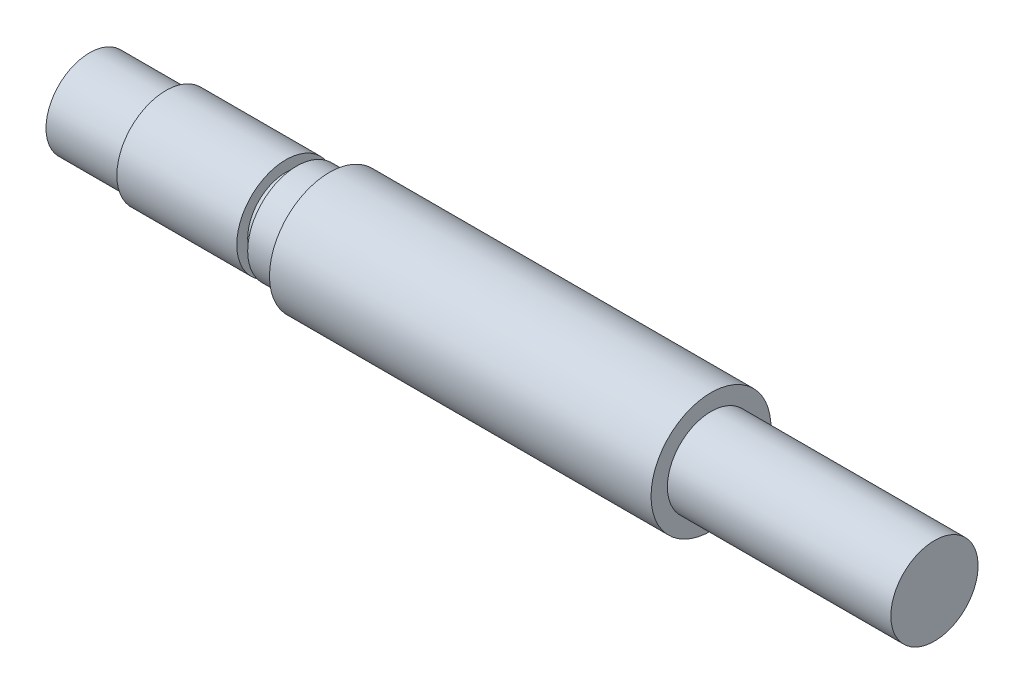
ISO-10303-21;
HEADER;
FILE_DESCRIPTION(('STEP AP214'),'2;1');
FILE_NAME('part.step','',(''),(''),'','','');
FILE_SCHEMA(('AUTOMOTIVE_DESIGN { 1 0 10303 214 1 1 1 1 }'));
ENDSEC;
DATA;
#1=APPLICATION_CONTEXT('core data for automotive mechanical design processes');
#2=APPLICATION_PROTOCOL_DEFINITION('international standard','automotive_design',2000,#1);
#3=PRODUCT_CONTEXT('',#1,'mechanical');
#4=PRODUCT('Part','Part','',(#3));
#5=PRODUCT_RELATED_PRODUCT_CATEGORY('part','',(#4));
#6=PRODUCT_DEFINITION_FORMATION('','',#4);
#7=PRODUCT_DEFINITION_CONTEXT('part definition',#1,'design');
#8=PRODUCT_DEFINITION('design','',#6,#7);
#9=PRODUCT_DEFINITION_SHAPE('','',#8);
#10=(LENGTH_UNIT() NAMED_UNIT(*) SI_UNIT(.MILLI.,.METRE.));
#11=(NAMED_UNIT(*) PLANE_ANGLE_UNIT() SI_UNIT($,.RADIAN.));
#12=(NAMED_UNIT(*) SI_UNIT($,.STERADIAN.) SOLID_ANGLE_UNIT());
#13=UNCERTAINTY_MEASURE_WITH_UNIT(LENGTH_MEASURE(1.E-05),#10,'distance_accuracy_value','');
#14=(GEOMETRIC_REPRESENTATION_CONTEXT(3) GLOBAL_UNCERTAINTY_ASSIGNED_CONTEXT((#13)) GLOBAL_UNIT_ASSIGNED_CONTEXT((#10,
#11,#12)) REPRESENTATION_CONTEXT('',''));
#15=CARTESIAN_POINT('',(0.,0.,0.));
#16=DIRECTION('',(0.,0.,1.));
#17=DIRECTION('',(1.,0.,0.));
#18=AXIS2_PLACEMENT_3D('',#15,#16,#17);
#19=CARTESIAN_POINT('',(0.,0.,0.));
#20=DIRECTION('',(1.,0.,0.));
#21=DIRECTION('',(0.,0.,-1.));
#22=AXIS2_PLACEMENT_3D('',#19,#20,#21);
#23=PLANE('',#22);
#24=CARTESIAN_POINT('',(0.,0.,0.));
#25=DIRECTION('',(-1.,0.,0.));
#26=DIRECTION('',(0.,0.,1.));
#27=AXIS2_PLACEMENT_3D('',#24,#25,#26);
#28=CIRCLE('',#27,3.99999999999999);
#29=CARTESIAN_POINT('',(0.,0.,3.99999999999999));
#30=VERTEX_POINT('',#29);
#31=EDGE_CURVE('E10',#30,#30,#28,.T.);
#32=ORIENTED_EDGE('',*,*,#31,.T.);
#33=EDGE_LOOP('',(#32));
#34=FACE_BOUND('',#33,.T.);
#35=ADVANCED_FACE('F33',(#34),#23,.F.);
#36=CARTESIAN_POINT('',(0.,0.,0.));
#37=DIRECTION('',(-1.,0.,0.));
#38=DIRECTION('',(0.,0.,1.));
#39=AXIS2_PLACEMENT_3D('',#36,#37,#38);
#40=CYLINDRICAL_SURFACE('',#39,3.99999999999999);
#41=ORIENTED_EDGE('',*,*,#31,.F.);
#42=EDGE_LOOP('',(#41));
#43=FACE_BOUND('',#42,.T.);
#44=CARTESIAN_POINT('',(7.,0.,0.));
#45=DIRECTION('',(-1.,0.,0.));
#46=DIRECTION('',(0.,0.,1.));
#47=AXIS2_PLACEMENT_3D('',#44,#45,#46);
#48=CIRCLE('',#47,3.99999999999999);
#49=CARTESIAN_POINT('',(7.,0.,3.99999999999999));
#50=VERTEX_POINT('',#49);
#51=EDGE_CURVE('E39',#50,#50,#48,.T.);
#52=ORIENTED_EDGE('',*,*,#51,.T.);
#53=EDGE_LOOP('',(#52));
#54=FACE_BOUND('',#53,.T.);
#55=ADVANCED_FACE('F89',(#43,#54),#40,.T.);
#56=CARTESIAN_POINT('',(7.,3.99999999999999,0.));
#57=DIRECTION('',(1.,0.,0.));
#58=DIRECTION('',(0.,0.,-1.));
#59=AXIS2_PLACEMENT_3D('',#56,#57,#58);
#60=PLANE('',#59);
#61=ORIENTED_EDGE('',*,*,#51,.F.);
#62=EDGE_LOOP('',(#61));
#63=FACE_BOUND('',#62,.T.);
#64=CARTESIAN_POINT('',(7.,0.,0.));
#65=DIRECTION('',(-1.,0.,0.));
#66=DIRECTION('',(0.,0.,1.));
#67=AXIS2_PLACEMENT_3D('',#64,#65,#66);
#68=CIRCLE('',#67,4.5);
#69=CARTESIAN_POINT('',(7.,0.,4.5));
#70=VERTEX_POINT('',#69);
#71=EDGE_CURVE('E43',#70,#70,#68,.T.);
#72=ORIENTED_EDGE('',*,*,#71,.T.);
#73=EDGE_LOOP('',(#72));
#74=FACE_BOUND('',#73,.T.);
#75=ADVANCED_FACE('F93',(#63,#74),#60,.F.);
#76=CARTESIAN_POINT('',(0.,0.,0.));
#77=DIRECTION('',(-1.,0.,0.));
#78=DIRECTION('',(0.,0.,1.));
#79=AXIS2_PLACEMENT_3D('',#76,#77,#78);
#80=CYLINDRICAL_SURFACE('',#79,4.5);
#81=ORIENTED_EDGE('',*,*,#71,.F.);
#82=EDGE_LOOP('',(#81));
#83=FACE_BOUND('',#82,.T.);
#84=CARTESIAN_POINT('',(18.,0.,0.));
#85=DIRECTION('',(-1.,0.,0.));
#86=DIRECTION('',(0.,0.,1.));
#87=AXIS2_PLACEMENT_3D('',#84,#85,#86);
#88=CIRCLE('',#87,4.5);
#89=CARTESIAN_POINT('',(18.,0.,4.5));
#90=VERTEX_POINT('',#89);
#91=EDGE_CURVE('E47',#90,#90,#88,.T.);
#92=ORIENTED_EDGE('',*,*,#91,.T.);
#93=EDGE_LOOP('',(#92));
#94=FACE_BOUND('',#93,.T.);
#95=ADVANCED_FACE('F98',(#83,#94),#80,.T.);
#96=CARTESIAN_POINT('',(18.,4.5,0.));
#97=DIRECTION('',(-1.,0.,0.));
#98=DIRECTION('',(0.,0.,1.));
#99=AXIS2_PLACEMENT_3D('',#96,#97,#98);
#100=PLANE('',#99);
#101=ORIENTED_EDGE('',*,*,#91,.F.);
#102=EDGE_LOOP('',(#101));
#103=FACE_BOUND('',#102,.T.);
#104=CARTESIAN_POINT('',(18.,0.,0.));
#105=DIRECTION('',(-1.,0.,0.));
#106=DIRECTION('',(0.,0.,1.));
#107=AXIS2_PLACEMENT_3D('',#104,#105,#106);
#108=CIRCLE('',#107,3.5);
#109=CARTESIAN_POINT('',(18.,0.,3.5));
#110=VERTEX_POINT('',#109);
#111=EDGE_CURVE('E52',#110,#110,#108,.T.);
#112=ORIENTED_EDGE('',*,*,#111,.T.);
#113=EDGE_LOOP('',(#112));
#114=FACE_BOUND('',#113,.T.);
#115=ADVANCED_FACE('F104',(#103,#114),#100,.F.);
#116=CARTESIAN_POINT('',(0.,0.,0.));
#117=DIRECTION('',(-1.,0.,0.));
#118=DIRECTION('',(0.,0.,1.));
#119=AXIS2_PLACEMENT_3D('',#116,#117,#118);
#120=CYLINDRICAL_SURFACE('',#119,3.5);
#121=ORIENTED_EDGE('',*,*,#111,.F.);
#122=EDGE_LOOP('',(#121));
#123=FACE_BOUND('',#122,.T.);
#124=CARTESIAN_POINT('',(19.,0.,0.));
#125=DIRECTION('',(-1.,0.,0.));
#126=DIRECTION('',(0.,0.,1.));
#127=AXIS2_PLACEMENT_3D('',#124,#125,#126);
#128=CIRCLE('',#127,3.5);
#129=CARTESIAN_POINT('',(19.,0.,3.5));
#130=VERTEX_POINT('',#129);
#131=EDGE_CURVE('E55',#130,#130,#128,.T.);
#132=ORIENTED_EDGE('',*,*,#131,.T.);
#133=EDGE_LOOP('',(#132));
#134=FACE_BOUND('',#133,.T.);
#135=ADVANCED_FACE('F108',(#123,#134),#120,.T.);
#136=CARTESIAN_POINT('',(19.,3.5,0.));
#137=DIRECTION('',(1.,0.,0.));
#138=DIRECTION('',(0.,0.,-1.));
#139=AXIS2_PLACEMENT_3D('',#136,#137,#138);
#140=PLANE('',#139);
#141=ORIENTED_EDGE('',*,*,#131,.F.);
#142=EDGE_LOOP('',(#141));
#143=FACE_BOUND('',#142,.T.);
#144=CARTESIAN_POINT('',(19.,0.,0.));
#145=DIRECTION('',(-1.,0.,0.));
#146=DIRECTION('',(0.,0.,1.));
#147=AXIS2_PLACEMENT_3D('',#144,#145,#146);
#148=CIRCLE('',#147,4.5);
#149=CARTESIAN_POINT('',(19.,0.,4.5));
#150=VERTEX_POINT('',#149);
#151=EDGE_CURVE('E58',#150,#150,#148,.T.);
#152=ORIENTED_EDGE('',*,*,#151,.T.);
#153=EDGE_LOOP('',(#152));
#154=FACE_BOUND('',#153,.T.);
#155=ADVANCED_FACE('F112',(#143,#154),#140,.F.);
#156=CARTESIAN_POINT('',(0.,0.,0.));
#157=DIRECTION('',(-1.,0.,0.));
#158=DIRECTION('',(0.,0.,1.));
#159=AXIS2_PLACEMENT_3D('',#156,#157,#158);
#160=CYLINDRICAL_SURFACE('',#159,4.5);
#161=ORIENTED_EDGE('',*,*,#151,.F.);
#162=EDGE_LOOP('',(#161));
#163=FACE_BOUND('',#162,.T.);
#164=CARTESIAN_POINT('',(22.,0.,0.));
#165=DIRECTION('',(-1.,0.,0.));
#166=DIRECTION('',(0.,0.,1.));
#167=AXIS2_PLACEMENT_3D('',#164,#165,#166);
#168=CIRCLE('',#167,4.5);
#169=CARTESIAN_POINT('',(22.,0.,4.5));
#170=VERTEX_POINT('',#169);
#171=EDGE_CURVE('E61',#170,#170,#168,.T.);
#172=ORIENTED_EDGE('',*,*,#171,.T.);
#173=EDGE_LOOP('',(#172));
#174=FACE_BOUND('',#173,.T.);
#175=ADVANCED_FACE('F116',(#163,#174),#160,.T.);
#176=CARTESIAN_POINT('',(22.,4.5,0.));
#177=DIRECTION('',(1.,0.,0.));
#178=DIRECTION('',(0.,0.,-1.));
#179=AXIS2_PLACEMENT_3D('',#176,#177,#178);
#180=PLANE('',#179);
#181=ORIENTED_EDGE('',*,*,#171,.F.);
#182=EDGE_LOOP('',(#181));
#183=FACE_BOUND('',#182,.T.);
#184=CARTESIAN_POINT('',(22.,0.,0.));
#185=DIRECTION('',(-1.,0.,0.));
#186=DIRECTION('',(0.,0.,1.));
#187=AXIS2_PLACEMENT_3D('',#184,#185,#186);
#188=CIRCLE('',#187,5.49999999999999);
#189=CARTESIAN_POINT('',(22.,0.,5.49999999999999));
#190=VERTEX_POINT('',#189);
#191=EDGE_CURVE('E64',#190,#190,#188,.T.);
#192=ORIENTED_EDGE('',*,*,#191,.T.);
#193=EDGE_LOOP('',(#192));
#194=FACE_BOUND('',#193,.T.);
#195=ADVANCED_FACE('F120',(#183,#194),#180,.F.);
#196=CARTESIAN_POINT('',(0.,0.,0.));
#197=DIRECTION('',(-1.,0.,0.));
#198=DIRECTION('',(0.,0.,1.));
#199=AXIS2_PLACEMENT_3D('',#196,#197,#198);
#200=CYLINDRICAL_SURFACE('',#199,5.49999999999999);
#201=ORIENTED_EDGE('',*,*,#191,.F.);
#202=EDGE_LOOP('',(#201));
#203=FACE_BOUND('',#202,.T.);
#204=CARTESIAN_POINT('',(57.,0.,0.));
#205=DIRECTION('',(-1.,0.,0.));
#206=DIRECTION('',(0.,0.,1.));
#207=AXIS2_PLACEMENT_3D('',#204,#205,#206);
#208=CIRCLE('',#207,5.49999999999999);
#209=CARTESIAN_POINT('',(57.,0.,5.49999999999999));
#210=VERTEX_POINT('',#209);
#211=EDGE_CURVE('E67',#210,#210,#208,.T.);
#212=ORIENTED_EDGE('',*,*,#211,.T.);
#213=EDGE_LOOP('',(#212));
#214=FACE_BOUND('',#213,.T.);
#215=ADVANCED_FACE('F124',(#203,#214),#200,.T.);
#216=CARTESIAN_POINT('',(57.,5.49999999999999,0.));
#217=DIRECTION('',(-1.,0.,0.));
#218=DIRECTION('',(0.,0.,1.));
#219=AXIS2_PLACEMENT_3D('',#216,#217,#218);
#220=PLANE('',#219);
#221=ORIENTED_EDGE('',*,*,#211,.F.);
#222=EDGE_LOOP('',(#221));
#223=FACE_BOUND('',#222,.T.);
#224=CARTESIAN_POINT('',(57.,0.,0.));
#225=DIRECTION('',(-1.,0.,0.));
#226=DIRECTION('',(0.,0.,1.));
#227=AXIS2_PLACEMENT_3D('',#224,#225,#226);
#228=CIRCLE('',#227,3.99999999999999);
#229=CARTESIAN_POINT('',(57.,0.,3.99999999999999));
#230=VERTEX_POINT('',#229);
#231=EDGE_CURVE('E70',#230,#230,#228,.T.);
#232=ORIENTED_EDGE('',*,*,#231,.T.);
#233=EDGE_LOOP('',(#232));
#234=FACE_BOUND('',#233,.T.);
#235=ADVANCED_FACE('F85',(#223,#234),#220,.F.);
#236=CARTESIAN_POINT('',(0.,0.,0.));
#237=DIRECTION('',(-1.,0.,0.));
#238=DIRECTION('',(0.,0.,1.));
#239=AXIS2_PLACEMENT_3D('',#236,#237,#238);
#240=CYLINDRICAL_SURFACE('',#239,3.99999999999999);
#241=ORIENTED_EDGE('',*,*,#231,.F.);
#242=EDGE_LOOP('',(#241));
#243=FACE_BOUND('',#242,.T.);
#244=CARTESIAN_POINT('',(77.5,0.,0.));
#245=DIRECTION('',(-1.,0.,0.));
#246=DIRECTION('',(0.,0.,1.));
#247=AXIS2_PLACEMENT_3D('',#244,#245,#246);
#248=CIRCLE('',#247,3.99999999999999);
#249=CARTESIAN_POINT('',(77.5,0.,3.99999999999999));
#250=VERTEX_POINT('',#249);
#251=EDGE_CURVE('E73',#250,#250,#248,.T.);
#252=ORIENTED_EDGE('',*,*,#251,.T.);
#253=EDGE_LOOP('',(#252));
#254=FACE_BOUND('',#253,.T.);
#255=ADVANCED_FACE('F77',(#243,#254),#240,.T.);
#256=CARTESIAN_POINT('',(77.5,3.99999999999999,0.));
#257=DIRECTION('',(-1.,0.,0.));
#258=DIRECTION('',(0.,0.,1.));
#259=AXIS2_PLACEMENT_3D('',#256,#257,#258);
#260=PLANE('',#259);
#261=ORIENTED_EDGE('',*,*,#251,.F.);
#262=EDGE_LOOP('',(#261));
#263=FACE_BOUND('',#262,.T.);
#264=ADVANCED_FACE('F79',(#263),#260,.F.);
#265=CLOSED_SHELL('',(#35,#55,#75,#95,#115,#135,#155,#175,#195,#215,#235,#255,#264));
#266=MANIFOLD_SOLID_BREP('B2',#265);
#267=ADVANCED_BREP_SHAPE_REPRESENTATION('',(#18,#266),#14);
#268=SHAPE_DEFINITION_REPRESENTATION(#9,#267);
ENDSEC;
END-ISO-10303-21;
